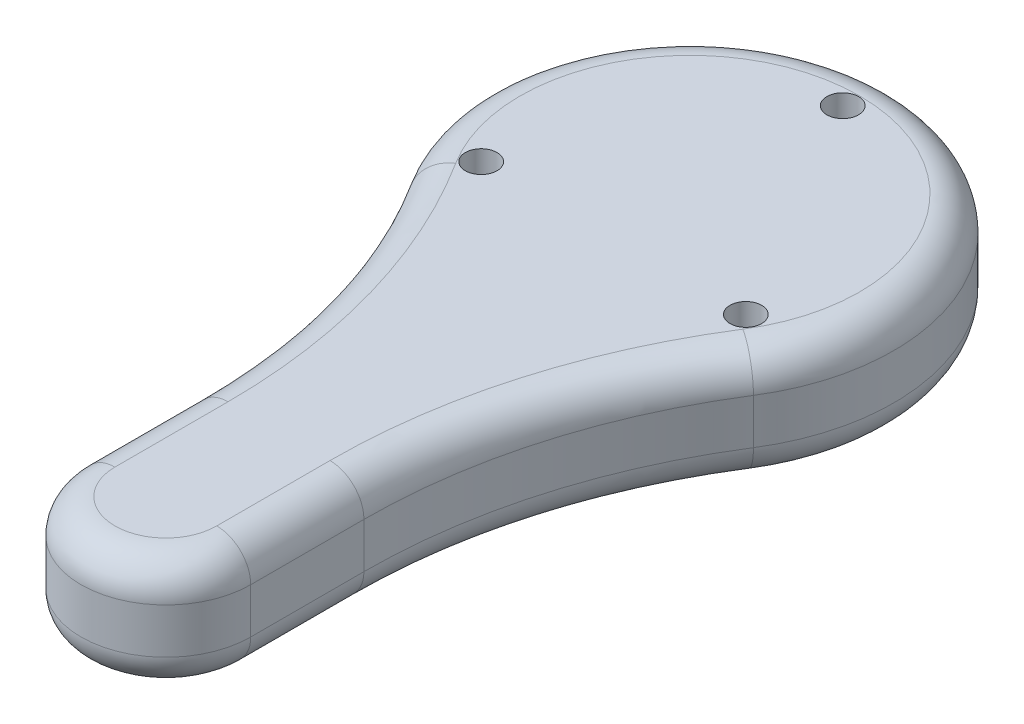
ISO-10303-21;
HEADER;
FILE_DESCRIPTION(('STEP AP214'),'2;1');
FILE_NAME('part.step','',(''),(''),'','','');
FILE_SCHEMA(('AUTOMOTIVE_DESIGN { 1 0 10303 214 1 1 1 1 }'));
ENDSEC;
DATA;
#1=APPLICATION_CONTEXT('core data for automotive mechanical design processes');
#2=APPLICATION_PROTOCOL_DEFINITION('international standard','automotive_design',2000,#1);
#3=PRODUCT_CONTEXT('',#1,'mechanical');
#4=PRODUCT('Part','Part','',(#3));
#5=PRODUCT_RELATED_PRODUCT_CATEGORY('part','',(#4));
#6=PRODUCT_DEFINITION_FORMATION('','',#4);
#7=PRODUCT_DEFINITION_CONTEXT('part definition',#1,'design');
#8=PRODUCT_DEFINITION('design','',#6,#7);
#9=PRODUCT_DEFINITION_SHAPE('','',#8);
#10=(LENGTH_UNIT() NAMED_UNIT(*) SI_UNIT(.MILLI.,.METRE.));
#11=(NAMED_UNIT(*) PLANE_ANGLE_UNIT() SI_UNIT($,.RADIAN.));
#12=(NAMED_UNIT(*) SI_UNIT($,.STERADIAN.) SOLID_ANGLE_UNIT());
#13=UNCERTAINTY_MEASURE_WITH_UNIT(LENGTH_MEASURE(1.E-05),#10,'distance_accuracy_value','');
#14=(GEOMETRIC_REPRESENTATION_CONTEXT(3) GLOBAL_UNCERTAINTY_ASSIGNED_CONTEXT((#13)) GLOBAL_UNIT_ASSIGNED_CONTEXT((#10,
#11,#12)) REPRESENTATION_CONTEXT('',''));
#15=CARTESIAN_POINT('',(0.,0.,0.));
#16=DIRECTION('',(0.,0.,1.));
#17=DIRECTION('',(1.,0.,0.));
#18=AXIS2_PLACEMENT_3D('',#15,#16,#17);
#19=CARTESIAN_POINT('',(57.5,10.,36.3008264368739));
#20=DIRECTION('',(0.,-1.,0.));
#21=DIRECTION('',(0.,0.,-1.));
#22=AXIS2_PLACEMENT_3D('',#19,#20,#21);
#23=CYLINDRICAL_SURFACE('',#22,50.);
#24=DIRECTION('',(0.,-1.,0.));
#25=VECTOR('',#24,1.);
#26=CARTESIAN_POINT('',(7.5,10.,36.3008264368739));
#27=LINE('',#26,#25);
#28=CARTESIAN_POINT('',(7.5,7.,36.3008264368739));
#29=VERTEX_POINT('',#28);
#30=CARTESIAN_POINT('',(7.5,3.,36.3008264368739));
#31=VERTEX_POINT('',#30);
#32=EDGE_CURVE('E220',#29,#31,#27,.T.);
#33=ORIENTED_EDGE('',*,*,#32,.T.);
#34=CARTESIAN_POINT('',(57.5,3.,36.3008264368739));
#35=DIRECTION('',(0.,1.,0.));
#36=DIRECTION('',(0.,0.,1.));
#37=AXIS2_PLACEMENT_3D('',#34,#35,#36);
#38=CIRCLE('',#37,50.);
#39=CARTESIAN_POINT('',(15.2205882352942,3.,9.60904229211375));
#40=VERTEX_POINT('',#39);
#41=EDGE_CURVE('E195',#31,#40,#38,.F.);
#42=ORIENTED_EDGE('',*,*,#41,.T.);
#43=DIRECTION('',(0.,-1.,0.));
#44=VECTOR('',#43,1.);
#45=CARTESIAN_POINT('',(15.2205882352942,10.,9.60904229211375));
#46=LINE('',#45,#44);
#47=CARTESIAN_POINT('',(15.2205882352942,7.,9.60904229211375));
#48=VERTEX_POINT('',#47);
#49=EDGE_CURVE('E149',#48,#40,#46,.T.);
#50=ORIENTED_EDGE('',*,*,#49,.F.);
#51=CARTESIAN_POINT('',(57.5,7.,36.3008264368739));
#52=DIRECTION('',(0.,1.,0.));
#53=DIRECTION('',(0.,0.,1.));
#54=AXIS2_PLACEMENT_3D('',#51,#52,#53);
#55=CIRCLE('',#54,50.);
#56=EDGE_CURVE('E193',#48,#29,#55,.T.);
#57=ORIENTED_EDGE('',*,*,#56,.T.);
#58=EDGE_LOOP('',(#33,#42,#50,#57));
#59=FACE_BOUND('',#58,.T.);
#60=ADVANCED_FACE('F37',(#59),#23,.F.);
#61=CARTESIAN_POINT('',(0.,10.,0.));
#62=DIRECTION('',(0.,-1.,0.));
#63=DIRECTION('',(0.,0.,-1.));
#64=AXIS2_PLACEMENT_3D('',#61,#62,#63);
#65=CYLINDRICAL_SURFACE('',#64,18.0000000000002);
#66=ORIENTED_EDGE('',*,*,#49,.T.);
#67=CARTESIAN_POINT('',(0.,3.,0.));
#68=DIRECTION('',(0.,1.,0.));
#69=DIRECTION('',(0.,0.,1.));
#70=AXIS2_PLACEMENT_3D('',#67,#68,#69);
#71=CIRCLE('',#70,18.0000000000002);
#72=CARTESIAN_POINT('',(-15.2205882352942,3.,9.60904229211375));
#73=VERTEX_POINT('',#72);
#74=EDGE_CURVE('E148',#40,#73,#71,.T.);
#75=ORIENTED_EDGE('',*,*,#74,.T.);
#76=DIRECTION('',(0.,-1.,0.));
#77=VECTOR('',#76,1.);
#78=CARTESIAN_POINT('',(-15.2205882352942,10.,9.60904229211375));
#79=LINE('',#78,#77);
#80=CARTESIAN_POINT('',(-15.2205882352942,7.,9.60904229211375));
#81=VERTEX_POINT('',#80);
#82=EDGE_CURVE('E130',#81,#73,#79,.T.);
#83=ORIENTED_EDGE('',*,*,#82,.F.);
#84=CARTESIAN_POINT('',(0.,7.,0.));
#85=DIRECTION('',(0.,1.,0.));
#86=DIRECTION('',(0.,0.,1.));
#87=AXIS2_PLACEMENT_3D('',#84,#85,#86);
#88=CIRCLE('',#87,18.0000000000002);
#89=EDGE_CURVE('E145',#81,#48,#88,.F.);
#90=ORIENTED_EDGE('',*,*,#89,.T.);
#91=EDGE_LOOP('',(#66,#75,#83,#90));
#92=FACE_BOUND('',#91,.T.);
#93=ADVANCED_FACE('F143',(#92),#65,.T.);
#94=CARTESIAN_POINT('',(-57.5,10.,36.3008264368739));
#95=DIRECTION('',(0.,-1.,0.));
#96=DIRECTION('',(0.,0.,-1.));
#97=AXIS2_PLACEMENT_3D('',#94,#95,#96);
#98=CYLINDRICAL_SURFACE('',#97,50.);
#99=ORIENTED_EDGE('',*,*,#82,.T.);
#100=CARTESIAN_POINT('',(-57.5,3.,36.3008264368739));
#101=DIRECTION('',(0.,1.,0.));
#102=DIRECTION('',(0.,0.,1.));
#103=AXIS2_PLACEMENT_3D('',#100,#101,#102);
#104=CIRCLE('',#103,50.);
#105=CARTESIAN_POINT('',(-7.49999999999996,3.,36.3008264368739));
#106=VERTEX_POINT('',#105);
#107=EDGE_CURVE('E137',#73,#106,#104,.F.);
#108=ORIENTED_EDGE('',*,*,#107,.T.);
#109=DIRECTION('',(0.,-1.,0.));
#110=VECTOR('',#109,1.);
#111=CARTESIAN_POINT('',(-7.49999999999996,10.,36.3008264368739));
#112=LINE('',#111,#110);
#113=CARTESIAN_POINT('',(-7.49999999999996,7.,36.3008264368739));
#114=VERTEX_POINT('',#113);
#115=EDGE_CURVE('E132',#114,#106,#112,.T.);
#116=ORIENTED_EDGE('',*,*,#115,.F.);
#117=CARTESIAN_POINT('',(-57.5,7.,36.3008264368739));
#118=DIRECTION('',(0.,1.,0.));
#119=DIRECTION('',(0.,0.,1.));
#120=AXIS2_PLACEMENT_3D('',#117,#118,#119);
#121=CIRCLE('',#120,50.);
#122=EDGE_CURVE('E127',#114,#81,#121,.T.);
#123=ORIENTED_EDGE('',*,*,#122,.T.);
#124=EDGE_LOOP('',(#99,#108,#116,#123));
#125=FACE_BOUND('',#124,.T.);
#126=ADVANCED_FACE('F129',(#125),#98,.F.);
#127=CARTESIAN_POINT('',(-7.5,10.,36.3008264368739));
#128=DIRECTION('',(1.,0.,0.));
#129=DIRECTION('',(0.,0.,-1.));
#130=AXIS2_PLACEMENT_3D('',#127,#128,#129);
#131=PLANE('',#130);
#132=ORIENTED_EDGE('',*,*,#115,.T.);
#133=DIRECTION('',(0.,0.,1.));
#134=VECTOR('',#133,1.);
#135=CARTESIAN_POINT('',(-7.5,3.,36.3008264368739));
#136=LINE('',#135,#134);
#137=CARTESIAN_POINT('',(-7.5,3.,46.3008264368739));
#138=VERTEX_POINT('',#137);
#139=EDGE_CURVE('E182',#106,#138,#136,.T.);
#140=ORIENTED_EDGE('',*,*,#139,.T.);
#141=DIRECTION('',(0.,-1.,0.));
#142=VECTOR('',#141,1.);
#143=CARTESIAN_POINT('',(-7.5,10.,46.3008264368739));
#144=LINE('',#143,#142);
#145=CARTESIAN_POINT('',(-7.5,7.,46.3008264368739));
#146=VERTEX_POINT('',#145);
#147=EDGE_CURVE('E239',#146,#138,#144,.T.);
#148=ORIENTED_EDGE('',*,*,#147,.F.);
#149=DIRECTION('',(0.,0.,1.));
#150=VECTOR('',#149,1.);
#151=CARTESIAN_POINT('',(-7.5,7.,36.3008264368739));
#152=LINE('',#151,#150);
#153=EDGE_CURVE('E180',#146,#114,#152,.F.);
#154=ORIENTED_EDGE('',*,*,#153,.T.);
#155=EDGE_LOOP('',(#132,#140,#148,#154));
#156=FACE_BOUND('',#155,.T.);
#157=ADVANCED_FACE('F236',(#156),#131,.F.);
#158=CARTESIAN_POINT('',(0.,10.,46.3008264368739));
#159=DIRECTION('',(0.,-1.,0.));
#160=DIRECTION('',(0.,0.,-1.));
#161=AXIS2_PLACEMENT_3D('',#158,#159,#160);
#162=CYLINDRICAL_SURFACE('',#161,7.5);
#163=ORIENTED_EDGE('',*,*,#147,.T.);
#164=CARTESIAN_POINT('',(0.,3.,46.3008264368739));
#165=DIRECTION('',(0.,1.,0.));
#166=DIRECTION('',(0.,0.,1.));
#167=AXIS2_PLACEMENT_3D('',#164,#165,#166);
#168=CIRCLE('',#167,7.5);
#169=CARTESIAN_POINT('',(7.5,3.,46.3008264368739));
#170=VERTEX_POINT('',#169);
#171=EDGE_CURVE('E186',#138,#170,#168,.T.);
#172=ORIENTED_EDGE('',*,*,#171,.T.);
#173=DIRECTION('',(0.,-1.,0.));
#174=VECTOR('',#173,1.);
#175=CARTESIAN_POINT('',(7.5,10.,46.3008264368739));
#176=LINE('',#175,#174);
#177=CARTESIAN_POINT('',(7.5,7.,46.3008264368739));
#178=VERTEX_POINT('',#177);
#179=EDGE_CURVE('E242',#178,#170,#176,.T.);
#180=ORIENTED_EDGE('',*,*,#179,.F.);
#181=CARTESIAN_POINT('',(0.,7.,46.3008264368739));
#182=DIRECTION('',(0.,1.,0.));
#183=DIRECTION('',(0.,0.,1.));
#184=AXIS2_PLACEMENT_3D('',#181,#182,#183);
#185=CIRCLE('',#184,7.5);
#186=EDGE_CURVE('E184',#178,#146,#185,.F.);
#187=ORIENTED_EDGE('',*,*,#186,.T.);
#188=EDGE_LOOP('',(#163,#172,#180,#187));
#189=FACE_BOUND('',#188,.T.);
#190=ADVANCED_FACE('F395',(#189),#162,.T.);
#191=CARTESIAN_POINT('',(7.5,10.,36.3008264368739));
#192=DIRECTION('',(-1.,0.,0.));
#193=DIRECTION('',(0.,0.,1.));
#194=AXIS2_PLACEMENT_3D('',#191,#192,#193);
#195=PLANE('',#194);
#196=ORIENTED_EDGE('',*,*,#179,.T.);
#197=DIRECTION('',(0.,0.,-1.));
#198=VECTOR('',#197,1.);
#199=CARTESIAN_POINT('',(7.5,3.,36.3008264368739));
#200=LINE('',#199,#198);
#201=EDGE_CURVE('E191',#170,#31,#200,.T.);
#202=ORIENTED_EDGE('',*,*,#201,.T.);
#203=ORIENTED_EDGE('',*,*,#32,.F.);
#204=DIRECTION('',(0.,0.,-1.));
#205=VECTOR('',#204,1.);
#206=CARTESIAN_POINT('',(7.5,7.,46.3008264368739));
#207=LINE('',#206,#205);
#208=EDGE_CURVE('E188',#29,#178,#207,.F.);
#209=ORIENTED_EDGE('',*,*,#208,.T.);
#210=EDGE_LOOP('',(#196,#202,#203,#209));
#211=FACE_BOUND('',#210,.T.);
#212=ADVANCED_FACE('F281',(#211),#195,.F.);
#213=CARTESIAN_POINT('',(57.5,10.,36.3008264368739));
#214=DIRECTION('',(0.,1.,0.));
#215=DIRECTION('',(0.,0.,1.));
#216=AXIS2_PLACEMENT_3D('',#213,#214,#215);
#217=PLANE('',#216);
#218=CARTESIAN_POINT('',(-1.15971982188188E-13,10.,-13.5));
#219=DIRECTION('',(0.,1.,0.));
#220=DIRECTION('',(0.,0.,1.));
#221=AXIS2_PLACEMENT_3D('',#218,#219,#220);
#222=CIRCLE('',#221,1.4);
#223=CARTESIAN_POINT('',(-1.15971982188188E-13,10.,-12.1));
#224=VERTEX_POINT('',#223);
#225=EDGE_CURVE('E262',#224,#224,#222,.T.);
#226=ORIENTED_EDGE('',*,*,#225,.F.);
#227=EDGE_LOOP('',(#226));
#228=FACE_BOUND('',#227,.T.);
#229=CARTESIAN_POINT('',(-11.6913429510899,10.,6.7500000000001));
#230=DIRECTION('',(0.,1.,0.));
#231=DIRECTION('',(0.,0.,1.));
#232=AXIS2_PLACEMENT_3D('',#229,#230,#231);
#233=CIRCLE('',#232,1.4);
#234=CARTESIAN_POINT('',(-11.6913429510899,10.,8.1500000000001));
#235=VERTEX_POINT('',#234);
#236=EDGE_CURVE('E259',#235,#235,#233,.T.);
#237=ORIENTED_EDGE('',*,*,#236,.F.);
#238=EDGE_LOOP('',(#237));
#239=FACE_BOUND('',#238,.T.);
#240=CARTESIAN_POINT('',(11.69134295109,10.,6.7499999999999));
#241=DIRECTION('',(0.,1.,0.));
#242=DIRECTION('',(0.,0.,1.));
#243=AXIS2_PLACEMENT_3D('',#240,#241,#242);
#244=CIRCLE('',#243,1.4);
#245=CARTESIAN_POINT('',(11.69134295109,10.,8.1499999999999));
#246=VERTEX_POINT('',#245);
#247=EDGE_CURVE('E253',#246,#246,#244,.T.);
#248=ORIENTED_EDGE('',*,*,#247,.F.);
#249=EDGE_LOOP('',(#248));
#250=FACE_BOUND('',#249,.T.);
#251=CARTESIAN_POINT('',(0.,10.,46.3008264368739));
#252=DIRECTION('',(0.,1.,0.));
#253=DIRECTION('',(0.,0.,1.));
#254=AXIS2_PLACEMENT_3D('',#251,#252,#253);
#255=CIRCLE('',#254,4.5);
#256=CARTESIAN_POINT('',(-4.5,10.,46.3008264368739));
#257=VERTEX_POINT('',#256);
#258=CARTESIAN_POINT('',(4.5,10.,46.3008264368739));
#259=VERTEX_POINT('',#258);
#260=EDGE_CURVE('E46',#257,#259,#255,.T.);
#261=ORIENTED_EDGE('',*,*,#260,.T.);
#262=DIRECTION('',(0.,0.,-1.));
#263=VECTOR('',#262,1.);
#264=CARTESIAN_POINT('',(4.5,10.,36.3008264368739));
#265=LINE('',#264,#263);
#266=CARTESIAN_POINT('',(4.49999999999996,10.,36.3008264368739));
#267=VERTEX_POINT('',#266);
#268=EDGE_CURVE('E11',#259,#267,#265,.T.);
#269=ORIENTED_EDGE('',*,*,#268,.T.);
#270=CARTESIAN_POINT('',(57.5,10.,36.3008264368739));
#271=DIRECTION('',(0.,1.,0.));
#272=DIRECTION('',(0.,0.,1.));
#273=AXIS2_PLACEMENT_3D('',#270,#271,#272);
#274=CIRCLE('',#273,53.);
#275=CARTESIAN_POINT('',(12.6838235294119,10.,8.00753524342817));
#276=VERTEX_POINT('',#275);
#277=EDGE_CURVE('E197',#267,#276,#274,.F.);
#278=ORIENTED_EDGE('',*,*,#277,.T.);
#279=CARTESIAN_POINT('',(0.,10.,0.));
#280=DIRECTION('',(0.,1.,0.));
#281=DIRECTION('',(0.,0.,1.));
#282=AXIS2_PLACEMENT_3D('',#279,#280,#281);
#283=CIRCLE('',#282,15.0000000000002);
#284=CARTESIAN_POINT('',(-12.6838235294119,10.,8.00753524342815));
#285=VERTEX_POINT('',#284);
#286=EDGE_CURVE('E199',#276,#285,#283,.T.);
#287=ORIENTED_EDGE('',*,*,#286,.T.);
#288=CARTESIAN_POINT('',(-57.5,10.,36.3008264368739));
#289=DIRECTION('',(0.,1.,0.));
#290=DIRECTION('',(0.,0.,1.));
#291=AXIS2_PLACEMENT_3D('',#288,#289,#290);
#292=CIRCLE('',#291,53.);
#293=CARTESIAN_POINT('',(-4.49999999999996,10.,36.3008264368739));
#294=VERTEX_POINT('',#293);
#295=EDGE_CURVE('E154',#285,#294,#292,.F.);
#296=ORIENTED_EDGE('',*,*,#295,.T.);
#297=DIRECTION('',(0.,0.,1.));
#298=VECTOR('',#297,1.);
#299=CARTESIAN_POINT('',(-4.5,10.,46.3008264368739));
#300=LINE('',#299,#298);
#301=EDGE_CURVE('E57',#294,#257,#300,.T.);
#302=ORIENTED_EDGE('',*,*,#301,.T.);
#303=EDGE_LOOP('',(#261,#269,#278,#287,#296,#302));
#304=FACE_BOUND('',#303,.T.);
#305=ADVANCED_FACE('F278',(#228,#239,#250,#304),#217,.T.);
#306=CARTESIAN_POINT('',(57.5,0.,36.3008264368739));
#307=DIRECTION('',(0.,1.,0.));
#308=DIRECTION('',(0.,0.,1.));
#309=AXIS2_PLACEMENT_3D('',#306,#307,#308);
#310=PLANE('',#309);
#311=CARTESIAN_POINT('',(-1.15971982188188E-13,0.,-13.5));
#312=DIRECTION('',(0.,1.,0.));
#313=DIRECTION('',(0.,0.,1.));
#314=AXIS2_PLACEMENT_3D('',#311,#312,#313);
#315=CIRCLE('',#314,1.4);
#316=CARTESIAN_POINT('',(-1.15971982188188E-13,0.,-12.1));
#317=VERTEX_POINT('',#316);
#318=EDGE_CURVE('E224',#317,#317,#315,.T.);
#319=ORIENTED_EDGE('',*,*,#318,.T.);
#320=EDGE_LOOP('',(#319));
#321=FACE_BOUND('',#320,.T.);
#322=CARTESIAN_POINT('',(-11.6913429510899,0.,6.7500000000001));
#323=DIRECTION('',(0.,1.,0.));
#324=DIRECTION('',(0.,0.,1.));
#325=AXIS2_PLACEMENT_3D('',#322,#323,#324);
#326=CIRCLE('',#325,1.4);
#327=CARTESIAN_POINT('',(-11.6913429510899,0.,8.1500000000001));
#328=VERTEX_POINT('',#327);
#329=EDGE_CURVE('E256',#328,#328,#326,.T.);
#330=ORIENTED_EDGE('',*,*,#329,.T.);
#331=EDGE_LOOP('',(#330));
#332=FACE_BOUND('',#331,.T.);
#333=CARTESIAN_POINT('',(11.69134295109,0.,6.7499999999999));
#334=DIRECTION('',(0.,1.,0.));
#335=DIRECTION('',(0.,0.,1.));
#336=AXIS2_PLACEMENT_3D('',#333,#334,#335);
#337=CIRCLE('',#336,1.4);
#338=CARTESIAN_POINT('',(11.69134295109,0.,8.1499999999999));
#339=VERTEX_POINT('',#338);
#340=EDGE_CURVE('E250',#339,#339,#337,.T.);
#341=ORIENTED_EDGE('',*,*,#340,.T.);
#342=EDGE_LOOP('',(#341));
#343=FACE_BOUND('',#342,.T.);
#344=CARTESIAN_POINT('',(-57.5,0.,36.3008264368739));
#345=DIRECTION('',(0.,1.,0.));
#346=DIRECTION('',(0.,0.,1.));
#347=AXIS2_PLACEMENT_3D('',#344,#345,#346);
#348=CIRCLE('',#347,53.);
#349=CARTESIAN_POINT('',(-4.5,0.,36.3008264368739));
#350=VERTEX_POINT('',#349);
#351=CARTESIAN_POINT('',(-12.6838235294119,0.,8.00753524342817));
#352=VERTEX_POINT('',#351);
#353=EDGE_CURVE('E175',#350,#352,#348,.T.);
#354=ORIENTED_EDGE('',*,*,#353,.T.);
#355=CARTESIAN_POINT('',(0.,0.,0.));
#356=DIRECTION('',(0.,1.,0.));
#357=DIRECTION('',(0.,0.,1.));
#358=AXIS2_PLACEMENT_3D('',#355,#356,#357);
#359=CIRCLE('',#358,15.0000000000002);
#360=CARTESIAN_POINT('',(12.6838235294119,0.,8.00753524342817));
#361=VERTEX_POINT('',#360);
#362=EDGE_CURVE('E138',#352,#361,#359,.F.);
#363=ORIENTED_EDGE('',*,*,#362,.T.);
#364=CARTESIAN_POINT('',(57.5,0.,36.3008264368739));
#365=DIRECTION('',(0.,1.,0.));
#366=DIRECTION('',(0.,0.,1.));
#367=AXIS2_PLACEMENT_3D('',#364,#365,#366);
#368=CIRCLE('',#367,53.);
#369=CARTESIAN_POINT('',(4.49999999999996,0.,36.3008264368739));
#370=VERTEX_POINT('',#369);
#371=EDGE_CURVE('E164',#361,#370,#368,.T.);
#372=ORIENTED_EDGE('',*,*,#371,.T.);
#373=DIRECTION('',(0.,0.,-1.));
#374=VECTOR('',#373,1.);
#375=CARTESIAN_POINT('',(4.5,0.,36.3008264368739));
#376=LINE('',#375,#374);
#377=CARTESIAN_POINT('',(4.5,0.,46.3008264368739));
#378=VERTEX_POINT('',#377);
#379=EDGE_CURVE('E169',#370,#378,#376,.F.);
#380=ORIENTED_EDGE('',*,*,#379,.T.);
#381=CARTESIAN_POINT('',(0.,0.,46.3008264368739));
#382=DIRECTION('',(0.,1.,0.));
#383=DIRECTION('',(0.,0.,1.));
#384=AXIS2_PLACEMENT_3D('',#381,#382,#383);
#385=CIRCLE('',#384,4.5);
#386=CARTESIAN_POINT('',(-4.5,0.,46.3008264368739));
#387=VERTEX_POINT('',#386);
#388=EDGE_CURVE('E171',#378,#387,#385,.F.);
#389=ORIENTED_EDGE('',*,*,#388,.T.);
#390=DIRECTION('',(0.,0.,1.));
#391=VECTOR('',#390,1.);
#392=CARTESIAN_POINT('',(-4.5,0.,36.3008264368739));
#393=LINE('',#392,#391);
#394=EDGE_CURVE('E173',#387,#350,#393,.F.);
#395=ORIENTED_EDGE('',*,*,#394,.T.);
#396=EDGE_LOOP('',(#354,#363,#372,#380,#389,#395));
#397=FACE_BOUND('',#396,.T.);
#398=ADVANCED_FACE('F268',(#321,#332,#343,#397),#310,.F.);
#399=CARTESIAN_POINT('',(0.,3.,46.3008264368739));
#400=DIRECTION('',(0.,1.,0.));
#401=DIRECTION('',(0.,0.,1.));
#402=AXIS2_PLACEMENT_3D('',#399,#400,#401);
#403=TOROIDAL_SURFACE('',#402,4.5,3.);
#404=CARTESIAN_POINT('',(-4.5,3.,46.3008264368739));
#405=DIRECTION('',(0.,0.,-1.));
#406=DIRECTION('',(-1.,0.,0.));
#407=AXIS2_PLACEMENT_3D('',#404,#405,#406);
#408=CIRCLE('',#407,3.);
#409=EDGE_CURVE('E214',#387,#138,#408,.T.);
#410=ORIENTED_EDGE('',*,*,#409,.F.);
#411=ORIENTED_EDGE('',*,*,#388,.F.);
#412=CARTESIAN_POINT('',(4.5,3.,46.3008264368739));
#413=DIRECTION('',(0.,0.,-1.));
#414=DIRECTION('',(-1.,0.,0.));
#415=AXIS2_PLACEMENT_3D('',#412,#413,#414);
#416=CIRCLE('',#415,3.);
#417=EDGE_CURVE('E217',#170,#378,#416,.T.);
#418=ORIENTED_EDGE('',*,*,#417,.F.);
#419=ORIENTED_EDGE('',*,*,#171,.F.);
#420=EDGE_LOOP('',(#410,#411,#418,#419));
#421=FACE_BOUND('',#420,.T.);
#422=ADVANCED_FACE('F330',(#421),#403,.T.);
#423=CARTESIAN_POINT('',(4.5,3.,36.3008264368739));
#424=DIRECTION('',(0.,0.,-1.));
#425=DIRECTION('',(-1.,0.,0.));
#426=AXIS2_PLACEMENT_3D('',#423,#424,#425);
#427=CYLINDRICAL_SURFACE('',#426,3.);
#428=ORIENTED_EDGE('',*,*,#417,.T.);
#429=ORIENTED_EDGE('',*,*,#379,.F.);
#430=CARTESIAN_POINT('',(4.5,3.,36.3008264368739));
#431=DIRECTION('',(0.,0.,-1.));
#432=DIRECTION('',(-1.,0.,0.));
#433=AXIS2_PLACEMENT_3D('',#430,#431,#432);
#434=CIRCLE('',#433,3.);
#435=EDGE_CURVE('E211',#31,#370,#434,.T.);
#436=ORIENTED_EDGE('',*,*,#435,.F.);
#437=ORIENTED_EDGE('',*,*,#201,.F.);
#438=EDGE_LOOP('',(#428,#429,#436,#437));
#439=FACE_BOUND('',#438,.T.);
#440=ADVANCED_FACE('F326',(#439),#427,.T.);
#441=CARTESIAN_POINT('',(-4.5,3.,36.3008264368739));
#442=DIRECTION('',(0.,0.,1.));
#443=DIRECTION('',(1.,0.,0.));
#444=AXIS2_PLACEMENT_3D('',#441,#442,#443);
#445=CYLINDRICAL_SURFACE('',#444,3.);
#446=ORIENTED_EDGE('',*,*,#409,.T.);
#447=ORIENTED_EDGE('',*,*,#139,.F.);
#448=CARTESIAN_POINT('',(-4.5,3.,36.3008264368739));
#449=DIRECTION('',(0.,0.,-1.));
#450=DIRECTION('',(-1.,0.,0.));
#451=AXIS2_PLACEMENT_3D('',#448,#449,#450);
#452=CIRCLE('',#451,3.);
#453=EDGE_CURVE('E208',#350,#106,#452,.T.);
#454=ORIENTED_EDGE('',*,*,#453,.F.);
#455=ORIENTED_EDGE('',*,*,#394,.F.);
#456=EDGE_LOOP('',(#446,#447,#454,#455));
#457=FACE_BOUND('',#456,.T.);
#458=ADVANCED_FACE('F322',(#457),#445,.T.);
#459=CARTESIAN_POINT('',(57.5,3.,36.3008264368739));
#460=DIRECTION('',(0.,1.,0.));
#461=DIRECTION('',(0.,0.,1.));
#462=AXIS2_PLACEMENT_3D('',#459,#460,#461);
#463=TOROIDAL_SURFACE('',#462,53.,3.);
#464=ORIENTED_EDGE('',*,*,#435,.T.);
#465=ORIENTED_EDGE('',*,*,#371,.F.);
#466=CARTESIAN_POINT('',(12.6838235294119,3.,8.00753524342817));
#467=DIRECTION('',(0.533835682895202,0.,-0.845588235294114));
#468=DIRECTION('',(-0.845588235294114,0.,-0.533835682895202));
#469=AXIS2_PLACEMENT_3D('',#466,#467,#468);
#470=CIRCLE('',#469,3.);
#471=EDGE_CURVE('E206',#40,#361,#470,.T.);
#472=ORIENTED_EDGE('',*,*,#471,.F.);
#473=ORIENTED_EDGE('',*,*,#41,.F.);
#474=EDGE_LOOP('',(#464,#465,#472,#473));
#475=FACE_BOUND('',#474,.T.);
#476=ADVANCED_FACE('F318',(#475),#463,.T.);
#477=CARTESIAN_POINT('',(-57.5,3.,36.3008264368739));
#478=DIRECTION('',(0.,1.,0.));
#479=DIRECTION('',(0.,0.,1.));
#480=AXIS2_PLACEMENT_3D('',#477,#478,#479);
#481=TOROIDAL_SURFACE('',#480,53.,3.);
#482=ORIENTED_EDGE('',*,*,#453,.T.);
#483=ORIENTED_EDGE('',*,*,#107,.F.);
#484=CARTESIAN_POINT('',(-12.6838235294119,3.,8.00753524342817));
#485=DIRECTION('',(-0.533835682895201,0.,-0.845588235294114));
#486=DIRECTION('',(-0.845588235294114,0.,0.533835682895201));
#487=AXIS2_PLACEMENT_3D('',#484,#485,#486);
#488=CIRCLE('',#487,3.);
#489=EDGE_CURVE('E204',#352,#73,#488,.T.);
#490=ORIENTED_EDGE('',*,*,#489,.F.);
#491=ORIENTED_EDGE('',*,*,#353,.F.);
#492=EDGE_LOOP('',(#482,#483,#490,#491));
#493=FACE_BOUND('',#492,.T.);
#494=ADVANCED_FACE('F314',(#493),#481,.T.);
#495=CARTESIAN_POINT('',(0.,3.,0.));
#496=DIRECTION('',(0.,1.,0.));
#497=DIRECTION('',(0.,0.,1.));
#498=AXIS2_PLACEMENT_3D('',#495,#496,#497);
#499=TOROIDAL_SURFACE('',#498,15.0000000000002,3.);
#500=ORIENTED_EDGE('',*,*,#471,.T.);
#501=ORIENTED_EDGE('',*,*,#362,.F.);
#502=ORIENTED_EDGE('',*,*,#489,.T.);
#503=ORIENTED_EDGE('',*,*,#74,.F.);
#504=EDGE_LOOP('',(#500,#501,#502,#503));
#505=FACE_BOUND('',#504,.T.);
#506=ADVANCED_FACE('F311',(#505),#499,.T.);
#507=CARTESIAN_POINT('',(-57.5,7.,36.3008264368739));
#508=DIRECTION('',(0.,1.,0.));
#509=DIRECTION('',(0.,0.,1.));
#510=AXIS2_PLACEMENT_3D('',#507,#508,#509);
#511=TOROIDAL_SURFACE('',#510,53.,3.);
#512=CARTESIAN_POINT('',(-12.6838235294119,7.,8.00753524342817));
#513=DIRECTION('',(-0.533835682895201,0.,-0.845588235294114));
#514=DIRECTION('',(-0.845588235294114,0.,0.533835682895201));
#515=AXIS2_PLACEMENT_3D('',#512,#513,#514);
#516=CIRCLE('',#515,3.);
#517=EDGE_CURVE('E153',#81,#285,#516,.T.);
#518=ORIENTED_EDGE('',*,*,#517,.F.);
#519=ORIENTED_EDGE('',*,*,#122,.F.);
#520=CARTESIAN_POINT('',(-4.49999999999996,7.,36.3008264368739));
#521=DIRECTION('',(0.,0.,1.));
#522=DIRECTION('',(1.,0.,0.));
#523=AXIS2_PLACEMENT_3D('',#520,#521,#522);
#524=CIRCLE('',#523,3.);
#525=EDGE_CURVE('E41',#294,#114,#524,.T.);
#526=ORIENTED_EDGE('',*,*,#525,.F.);
#527=ORIENTED_EDGE('',*,*,#295,.F.);
#528=EDGE_LOOP('',(#518,#519,#526,#527));
#529=FACE_BOUND('',#528,.T.);
#530=ADVANCED_FACE('F39',(#529),#511,.T.);
#531=CARTESIAN_POINT('',(-4.5,7.,36.3008264368739));
#532=DIRECTION('',(0.,0.,-1.));
#533=DIRECTION('',(-1.,0.,0.));
#534=AXIS2_PLACEMENT_3D('',#531,#532,#533);
#535=CYLINDRICAL_SURFACE('',#534,3.);
#536=ORIENTED_EDGE('',*,*,#525,.T.);
#537=ORIENTED_EDGE('',*,*,#153,.F.);
#538=CARTESIAN_POINT('',(-4.5,7.,46.3008264368739));
#539=DIRECTION('',(0.,0.,1.));
#540=DIRECTION('',(1.,0.,0.));
#541=AXIS2_PLACEMENT_3D('',#538,#539,#540);
#542=CIRCLE('',#541,3.);
#543=EDGE_CURVE('E157',#257,#146,#542,.T.);
#544=ORIENTED_EDGE('',*,*,#543,.F.);
#545=ORIENTED_EDGE('',*,*,#301,.F.);
#546=EDGE_LOOP('',(#536,#537,#544,#545));
#547=FACE_BOUND('',#546,.T.);
#548=ADVANCED_FACE('F233',(#547),#535,.T.);
#549=CARTESIAN_POINT('',(0.,7.,0.));
#550=DIRECTION('',(0.,1.,0.));
#551=DIRECTION('',(0.,0.,1.));
#552=AXIS2_PLACEMENT_3D('',#549,#550,#551);
#553=TOROIDAL_SURFACE('',#552,15.0000000000002,3.);
#554=ORIENTED_EDGE('',*,*,#517,.T.);
#555=ORIENTED_EDGE('',*,*,#286,.F.);
#556=CARTESIAN_POINT('',(12.6838235294119,7.,8.00753524342815));
#557=DIRECTION('',(-0.533835682895202,0.,0.845588235294114));
#558=DIRECTION('',(0.845588235294114,0.,0.533835682895202));
#559=AXIS2_PLACEMENT_3D('',#556,#557,#558);
#560=CIRCLE('',#559,3.);
#561=EDGE_CURVE('E161',#48,#276,#560,.T.);
#562=ORIENTED_EDGE('',*,*,#561,.F.);
#563=ORIENTED_EDGE('',*,*,#89,.F.);
#564=EDGE_LOOP('',(#554,#555,#562,#563));
#565=FACE_BOUND('',#564,.T.);
#566=ADVANCED_FACE('F159',(#565),#553,.T.);
#567=CARTESIAN_POINT('',(0.,7.,46.3008264368739));
#568=DIRECTION('',(0.,1.,0.));
#569=DIRECTION('',(0.,0.,1.));
#570=AXIS2_PLACEMENT_3D('',#567,#568,#569);
#571=TOROIDAL_SURFACE('',#570,4.5,3.);
#572=ORIENTED_EDGE('',*,*,#543,.T.);
#573=ORIENTED_EDGE('',*,*,#186,.F.);
#574=CARTESIAN_POINT('',(4.5,7.,46.3008264368739));
#575=DIRECTION('',(0.,0.,-1.));
#576=DIRECTION('',(-1.,0.,0.));
#577=AXIS2_PLACEMENT_3D('',#574,#575,#576);
#578=CIRCLE('',#577,3.);
#579=EDGE_CURVE('E223',#259,#178,#578,.T.);
#580=ORIENTED_EDGE('',*,*,#579,.F.);
#581=ORIENTED_EDGE('',*,*,#260,.F.);
#582=EDGE_LOOP('',(#572,#573,#580,#581));
#583=FACE_BOUND('',#582,.T.);
#584=ADVANCED_FACE('F230',(#583),#571,.T.);
#585=CARTESIAN_POINT('',(57.5,7.,36.3008264368739));
#586=DIRECTION('',(0.,1.,0.));
#587=DIRECTION('',(0.,0.,1.));
#588=AXIS2_PLACEMENT_3D('',#585,#586,#587);
#589=TOROIDAL_SURFACE('',#588,53.,3.);
#590=ORIENTED_EDGE('',*,*,#561,.T.);
#591=ORIENTED_EDGE('',*,*,#277,.F.);
#592=CARTESIAN_POINT('',(4.49999999999996,7.,36.3008264368739));
#593=DIRECTION('',(0.,0.,1.));
#594=DIRECTION('',(1.,0.,0.));
#595=AXIS2_PLACEMENT_3D('',#592,#593,#594);
#596=CIRCLE('',#595,3.);
#597=EDGE_CURVE('E221',#29,#267,#596,.T.);
#598=ORIENTED_EDGE('',*,*,#597,.F.);
#599=ORIENTED_EDGE('',*,*,#56,.F.);
#600=EDGE_LOOP('',(#590,#591,#598,#599));
#601=FACE_BOUND('',#600,.T.);
#602=ADVANCED_FACE('F298',(#601),#589,.T.);
#603=CARTESIAN_POINT('',(4.5,7.,36.3008264368739));
#604=DIRECTION('',(0.,0.,1.));
#605=DIRECTION('',(1.,0.,0.));
#606=AXIS2_PLACEMENT_3D('',#603,#604,#605);
#607=CYLINDRICAL_SURFACE('',#606,3.);
#608=ORIENTED_EDGE('',*,*,#579,.T.);
#609=ORIENTED_EDGE('',*,*,#208,.F.);
#610=ORIENTED_EDGE('',*,*,#597,.T.);
#611=ORIENTED_EDGE('',*,*,#268,.F.);
#612=EDGE_LOOP('',(#608,#609,#610,#611));
#613=FACE_BOUND('',#612,.T.);
#614=ADVANCED_FACE('F289',(#613),#607,.T.);
#615=CARTESIAN_POINT('',(11.69134295109,0.,6.7499999999999));
#616=DIRECTION('',(0.,1.,0.));
#617=DIRECTION('',(0.,0.,1.));
#618=AXIS2_PLACEMENT_3D('',#615,#616,#617);
#619=CYLINDRICAL_SURFACE('',#618,1.4);
#620=ORIENTED_EDGE('',*,*,#340,.F.);
#621=EDGE_LOOP('',(#620));
#622=FACE_BOUND('',#621,.T.);
#623=ORIENTED_EDGE('',*,*,#247,.T.);
#624=EDGE_LOOP('',(#623));
#625=FACE_BOUND('',#624,.T.);
#626=ADVANCED_FACE('F287',(#622,#625),#619,.F.);
#627=CARTESIAN_POINT('',(-11.6913429510899,0.,6.7500000000001));
#628=DIRECTION('',(0.,1.,0.));
#629=DIRECTION('',(0.,0.,1.));
#630=AXIS2_PLACEMENT_3D('',#627,#628,#629);
#631=CYLINDRICAL_SURFACE('',#630,1.4);
#632=ORIENTED_EDGE('',*,*,#329,.F.);
#633=EDGE_LOOP('',(#632));
#634=FACE_BOUND('',#633,.T.);
#635=ORIENTED_EDGE('',*,*,#236,.T.);
#636=EDGE_LOOP('',(#635));
#637=FACE_BOUND('',#636,.T.);
#638=ADVANCED_FACE('F274',(#634,#637),#631,.F.);
#639=CARTESIAN_POINT('',(-1.15971982188188E-13,0.,-13.5));
#640=DIRECTION('',(0.,1.,0.));
#641=DIRECTION('',(0.,0.,1.));
#642=AXIS2_PLACEMENT_3D('',#639,#640,#641);
#643=CYLINDRICAL_SURFACE('',#642,1.4);
#644=ORIENTED_EDGE('',*,*,#318,.F.);
#645=EDGE_LOOP('',(#644));
#646=FACE_BOUND('',#645,.T.);
#647=ORIENTED_EDGE('',*,*,#225,.T.);
#648=EDGE_LOOP('',(#647));
#649=FACE_BOUND('',#648,.T.);
#650=ADVANCED_FACE('F271',(#646,#649),#643,.F.);
#651=CLOSED_SHELL('',(#60,#93,#126,#157,#190,#212,#305,#398,#422,#440,#458,#476,#494,#506,#530,
#548,#566,#584,#602,#614,#626,#638,#650));
#652=MANIFOLD_SOLID_BREP('B2',#651);
#653=ADVANCED_BREP_SHAPE_REPRESENTATION('',(#18,#652),#14);
#654=SHAPE_DEFINITION_REPRESENTATION(#9,#653);
ENDSEC;
END-ISO-10303-21;
